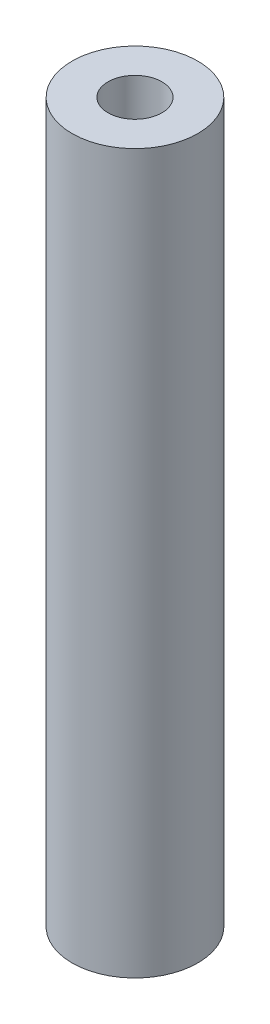
ISO-10303-21;
HEADER;
FILE_DESCRIPTION(('STEP AP214'),'2;1');
FILE_NAME('part.step','',(''),(''),'','','');
FILE_SCHEMA(('AUTOMOTIVE_DESIGN { 1 0 10303 214 1 1 1 1 }'));
ENDSEC;
DATA;
#1=APPLICATION_CONTEXT('core data for automotive mechanical design processes');
#2=APPLICATION_PROTOCOL_DEFINITION('international standard','automotive_design',2000,#1);
#3=PRODUCT_CONTEXT('',#1,'mechanical');
#4=PRODUCT('Part','Part','',(#3));
#5=PRODUCT_RELATED_PRODUCT_CATEGORY('part','',(#4));
#6=PRODUCT_DEFINITION_FORMATION('','',#4);
#7=PRODUCT_DEFINITION_CONTEXT('part definition',#1,'design');
#8=PRODUCT_DEFINITION('design','',#6,#7);
#9=PRODUCT_DEFINITION_SHAPE('','',#8);
#10=(LENGTH_UNIT() NAMED_UNIT(*) SI_UNIT(.MILLI.,.METRE.));
#11=(NAMED_UNIT(*) PLANE_ANGLE_UNIT() SI_UNIT($,.RADIAN.));
#12=(NAMED_UNIT(*) SI_UNIT($,.STERADIAN.) SOLID_ANGLE_UNIT());
#13=UNCERTAINTY_MEASURE_WITH_UNIT(LENGTH_MEASURE(1.E-05),#10,'distance_accuracy_value','');
#14=(GEOMETRIC_REPRESENTATION_CONTEXT(3) GLOBAL_UNCERTAINTY_ASSIGNED_CONTEXT((#13)) GLOBAL_UNIT_ASSIGNED_CONTEXT((#10,
#11,#12)) REPRESENTATION_CONTEXT('',''));
#15=CARTESIAN_POINT('',(0.,0.,0.));
#16=DIRECTION('',(0.,0.,1.));
#17=DIRECTION('',(1.,0.,0.));
#18=AXIS2_PLACEMENT_3D('',#15,#16,#17);
#19=CARTESIAN_POINT('',(0.,40.,0.));
#20=DIRECTION('',(0.,1.,0.));
#21=DIRECTION('',(0.,0.,1.));
#22=AXIS2_PLACEMENT_3D('',#19,#20,#21);
#23=PLANE('',#22);
#24=CARTESIAN_POINT('',(0.,40.,0.));
#25=DIRECTION('',(0.,1.,0.));
#26=DIRECTION('',(0.,0.,1.));
#27=AXIS2_PLACEMENT_3D('',#24,#25,#26);
#28=CIRCLE('',#27,3.5);
#29=CARTESIAN_POINT('',(0.,40.,3.5));
#30=VERTEX_POINT('',#29);
#31=EDGE_CURVE('E10',#30,#30,#28,.T.);
#32=ORIENTED_EDGE('',*,*,#31,.T.);
#33=EDGE_LOOP('',(#32));
#34=FACE_BOUND('',#33,.T.);
#35=CARTESIAN_POINT('',(0.,40.,0.));
#36=DIRECTION('',(0.,1.,0.));
#37=DIRECTION('',(0.,0.,1.));
#38=AXIS2_PLACEMENT_3D('',#35,#36,#37);
#39=CIRCLE('',#38,1.5);
#40=CARTESIAN_POINT('',(0.,40.,1.5));
#41=VERTEX_POINT('',#40);
#42=EDGE_CURVE('E48',#41,#41,#39,.T.);
#43=ORIENTED_EDGE('',*,*,#42,.F.);
#44=EDGE_LOOP('',(#43));
#45=FACE_BOUND('',#44,.T.);
#46=ADVANCED_FACE('F37',(#34,#45),#23,.T.);
#47=CARTESIAN_POINT('',(0.,0.,0.));
#48=DIRECTION('',(0.,1.,0.));
#49=DIRECTION('',(0.,0.,1.));
#50=AXIS2_PLACEMENT_3D('',#47,#48,#49);
#51=PLANE('',#50);
#52=CARTESIAN_POINT('',(0.,0.,0.));
#53=DIRECTION('',(0.,1.,0.));
#54=DIRECTION('',(0.,0.,1.));
#55=AXIS2_PLACEMENT_3D('',#52,#53,#54);
#56=CIRCLE('',#55,3.5);
#57=CARTESIAN_POINT('',(0.,0.,3.5));
#58=VERTEX_POINT('',#57);
#59=EDGE_CURVE('E41',#58,#58,#56,.T.);
#60=ORIENTED_EDGE('',*,*,#59,.F.);
#61=EDGE_LOOP('',(#60));
#62=FACE_BOUND('',#61,.T.);
#63=CARTESIAN_POINT('',(0.,0.,0.));
#64=DIRECTION('',(0.,1.,0.));
#65=DIRECTION('',(0.,0.,1.));
#66=AXIS2_PLACEMENT_3D('',#63,#64,#65);
#67=CIRCLE('',#66,1.5);
#68=CARTESIAN_POINT('',(0.,0.,1.5));
#69=VERTEX_POINT('',#68);
#70=EDGE_CURVE('E50',#69,#69,#67,.T.);
#71=ORIENTED_EDGE('',*,*,#70,.T.);
#72=EDGE_LOOP('',(#71));
#73=FACE_BOUND('',#72,.T.);
#74=ADVANCED_FACE('F60',(#62,#73),#51,.F.);
#75=CARTESIAN_POINT('',(0.,40.,0.));
#76=DIRECTION('',(0.,-1.,0.));
#77=DIRECTION('',(0.,0.,-1.));
#78=AXIS2_PLACEMENT_3D('',#75,#76,#77);
#79=CYLINDRICAL_SURFACE('',#78,3.5);
#80=ORIENTED_EDGE('',*,*,#31,.F.);
#81=EDGE_LOOP('',(#80));
#82=FACE_BOUND('',#81,.T.);
#83=ORIENTED_EDGE('',*,*,#59,.T.);
#84=EDGE_LOOP('',(#83));
#85=FACE_BOUND('',#84,.T.);
#86=ADVANCED_FACE('F39',(#82,#85),#79,.T.);
#87=CARTESIAN_POINT('',(0.,40.,0.));
#88=DIRECTION('',(0.,-1.,0.));
#89=DIRECTION('',(0.,0.,-1.));
#90=AXIS2_PLACEMENT_3D('',#87,#88,#89);
#91=CYLINDRICAL_SURFACE('',#90,1.5);
#92=ORIENTED_EDGE('',*,*,#42,.T.);
#93=EDGE_LOOP('',(#92));
#94=FACE_BOUND('',#93,.T.);
#95=ORIENTED_EDGE('',*,*,#70,.F.);
#96=EDGE_LOOP('',(#95));
#97=FACE_BOUND('',#96,.T.);
#98=ADVANCED_FACE('F56',(#94,#97),#91,.F.);
#99=CLOSED_SHELL('',(#46,#74,#86,#98));
#100=MANIFOLD_SOLID_BREP('B2',#99);
#101=ADVANCED_BREP_SHAPE_REPRESENTATION('',(#18,#100),#14);
#102=SHAPE_DEFINITION_REPRESENTATION(#9,#101);
ENDSEC;
END-ISO-10303-21;
